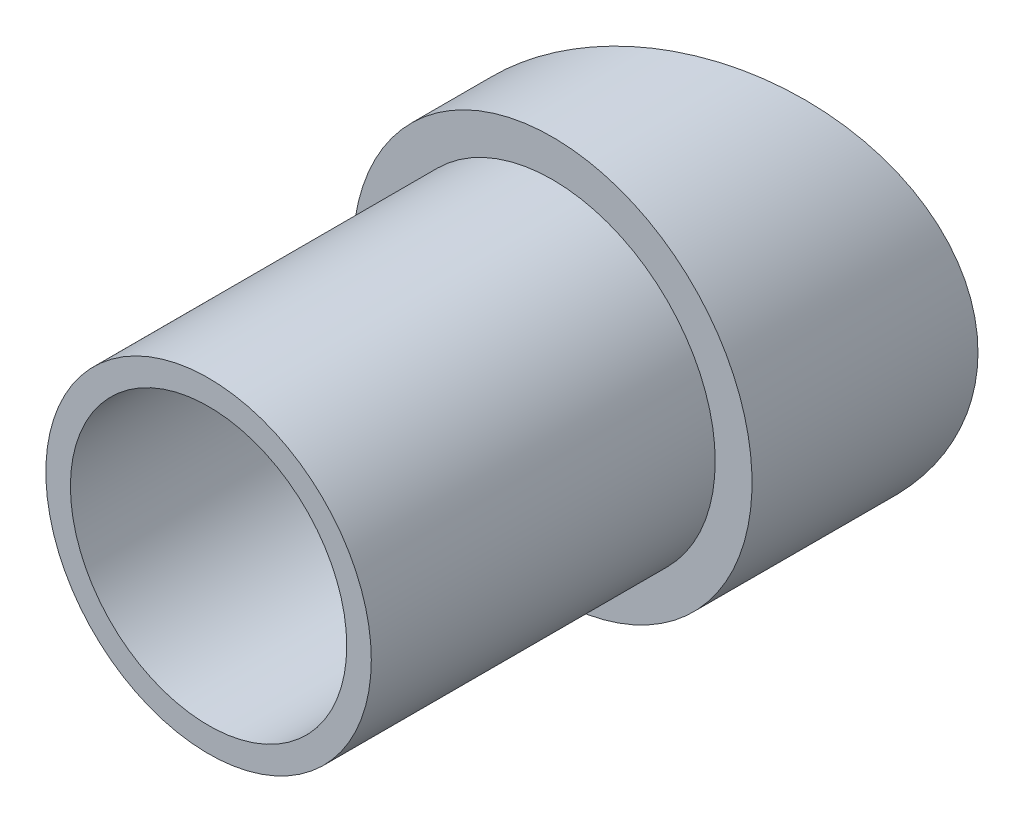
ISO-10303-21;
HEADER;
FILE_DESCRIPTION(('STEP AP214'),'2;1');
FILE_NAME('part.step','',(''),(''),'','','');
FILE_SCHEMA(('AUTOMOTIVE_DESIGN { 1 0 10303 214 1 1 1 1 }'));
ENDSEC;
DATA;
#1=APPLICATION_CONTEXT('core data for automotive mechanical design processes');
#2=APPLICATION_PROTOCOL_DEFINITION('international standard','automotive_design',2000,#1);
#3=PRODUCT_CONTEXT('',#1,'mechanical');
#4=PRODUCT('Part','Part','',(#3));
#5=PRODUCT_RELATED_PRODUCT_CATEGORY('part','',(#4));
#6=PRODUCT_DEFINITION_FORMATION('','',#4);
#7=PRODUCT_DEFINITION_CONTEXT('part definition',#1,'design');
#8=PRODUCT_DEFINITION('design','',#6,#7);
#9=PRODUCT_DEFINITION_SHAPE('','',#8);
#10=(LENGTH_UNIT() NAMED_UNIT(*) SI_UNIT(.MILLI.,.METRE.));
#11=(NAMED_UNIT(*) PLANE_ANGLE_UNIT() SI_UNIT($,.RADIAN.));
#12=(NAMED_UNIT(*) SI_UNIT($,.STERADIAN.) SOLID_ANGLE_UNIT());
#13=UNCERTAINTY_MEASURE_WITH_UNIT(LENGTH_MEASURE(1.E-05),#10,'distance_accuracy_value','');
#14=(GEOMETRIC_REPRESENTATION_CONTEXT(3) GLOBAL_UNCERTAINTY_ASSIGNED_CONTEXT((#13)) GLOBAL_UNIT_ASSIGNED_CONTEXT((#10,
#11,#12)) REPRESENTATION_CONTEXT('',''));
#15=CARTESIAN_POINT('',(0.,0.,0.));
#16=DIRECTION('',(0.,0.,1.));
#17=DIRECTION('',(1.,0.,0.));
#18=AXIS2_PLACEMENT_3D('',#15,#16,#17);
#19=CARTESIAN_POINT('',(4.27448013928005,0.,-29.4299558512105));
#20=DIRECTION('',(-0.390731128489275,0.,-0.92050485345244));
#21=DIRECTION('',(-0.92050485345244,0.,0.390731128489275));
#22=AXIS2_PLACEMENT_3D('',#19,#20,#21);
#23=CYLINDRICAL_SURFACE('',#22,2.1);
#24=CARTESIAN_POINT('',(0.,0.,-39.5));
#25=DIRECTION('',(-0.390731128489275,0.,-0.92050485345244));
#26=DIRECTION('',(-0.92050485345244,0.,0.390731128489275));
#27=AXIS2_PLACEMENT_3D('',#24,#25,#26);
#28=CIRCLE('',#27,2.1);
#29=CARTESIAN_POINT('',(-1.93306019225013,0.,-38.6794646301725));
#30=VERTEX_POINT('',#29);
#31=EDGE_CURVE('E144',#30,#30,#28,.T.);
#32=ORIENTED_EDGE('',*,*,#31,.T.);
#33=EDGE_LOOP('',(#32));
#34=FACE_BOUND('',#33,.T.);
#35=CARTESIAN_POINT('',(1.17219338546782,0.,-36.7384854396427));
#36=DIRECTION('',(0.390731128489274,0.,0.92050485345244));
#37=DIRECTION('',(0.92050485345244,0.,-0.390731128489274));
#38=AXIS2_PLACEMENT_3D('',#35,#36,#37);
#39=CIRCLE('',#38,2.1);
#40=CARTESIAN_POINT('',(3.10525357771794,0.,-37.5590208094702));
#41=VERTEX_POINT('',#40);
#42=EDGE_CURVE('E39',#41,#41,#39,.F.);
#43=ORIENTED_EDGE('',*,*,#42,.F.);
#44=EDGE_LOOP('',(#43));
#45=FACE_BOUND('',#44,.T.);
#46=ADVANCED_FACE('F35',(#34,#45),#23,.F.);
#47=CARTESIAN_POINT('',(0.,0.,-56.));
#48=DIRECTION('',(0.,0.,1.));
#49=DIRECTION('',(1.,0.,0.));
#50=AXIS2_PLACEMENT_3D('',#47,#48,#49);
#51=CYLINDRICAL_SURFACE('',#50,16.25);
#52=CARTESIAN_POINT('',(0.,0.,-28.));
#53=DIRECTION('',(0.,0.,-1.));
#54=DIRECTION('',(-1.,0.,0.));
#55=AXIS2_PLACEMENT_3D('',#52,#53,#54);
#56=CIRCLE('',#55,16.25);
#57=CARTESIAN_POINT('',(-16.25,0.,-28.));
#58=VERTEX_POINT('',#57);
#59=EDGE_CURVE('E153',#58,#58,#56,.T.);
#60=ORIENTED_EDGE('',*,*,#59,.T.);
#61=EDGE_LOOP('',(#60));
#62=FACE_BOUND('',#61,.T.);
#63=CARTESIAN_POINT('',(0.,0.,-39.5));
#64=DIRECTION('',(0.390731128489275,0.,0.92050485345244));
#65=DIRECTION('',(-0.92050485345244,0.,0.390731128489275));
#66=AXIS2_PLACEMENT_3D('',#63,#64,#65);
#67=ELLIPSE('',#66,17.6533561328361,16.25);
#68=CARTESIAN_POINT('',(-16.25,0.,-32.6022842365939));
#69=VERTEX_POINT('',#68);
#70=EDGE_CURVE('E12',#69,#69,#67,.T.);
#71=ORIENTED_EDGE('',*,*,#70,.T.);
#72=EDGE_LOOP('',(#71));
#73=FACE_BOUND('',#72,.T.);
#74=ADVANCED_FACE('F165',(#62,#73),#51,.T.);
#75=CARTESIAN_POINT('',(0.,0.,-28.));
#76=DIRECTION('',(0.,0.,1.));
#77=DIRECTION('',(1.,0.,0.));
#78=AXIS2_PLACEMENT_3D('',#75,#76,#77);
#79=CYLINDRICAL_SURFACE('',#78,13.25);
#80=CARTESIAN_POINT('',(0.,0.,-28.));
#81=DIRECTION('',(0.,0.,-1.));
#82=DIRECTION('',(-1.,0.,0.));
#83=AXIS2_PLACEMENT_3D('',#80,#81,#82);
#84=CIRCLE('',#83,13.25);
#85=CARTESIAN_POINT('',(-13.25,0.,-28.));
#86=VERTEX_POINT('',#85);
#87=EDGE_CURVE('E156',#86,#86,#84,.F.);
#88=ORIENTED_EDGE('',*,*,#87,.T.);
#89=EDGE_LOOP('',(#88));
#90=FACE_BOUND('',#89,.T.);
#91=CARTESIAN_POINT('',(0.,0.,0.));
#92=DIRECTION('',(0.,0.,1.));
#93=DIRECTION('',(1.,0.,0.));
#94=AXIS2_PLACEMENT_3D('',#91,#92,#93);
#95=CIRCLE('',#94,13.25);
#96=CARTESIAN_POINT('',(13.25,0.,0.));
#97=VERTEX_POINT('',#96);
#98=EDGE_CURVE('E44',#97,#97,#95,.T.);
#99=ORIENTED_EDGE('',*,*,#98,.F.);
#100=EDGE_LOOP('',(#99));
#101=FACE_BOUND('',#100,.T.);
#102=ADVANCED_FACE('F37',(#90,#101),#79,.T.);
#103=CARTESIAN_POINT('',(0.,0.,0.));
#104=DIRECTION('',(0.,0.,1.));
#105=DIRECTION('',(1.,0.,0.));
#106=AXIS2_PLACEMENT_3D('',#103,#104,#105);
#107=PLANE('',#106);
#108=CARTESIAN_POINT('',(0.,0.,0.));
#109=DIRECTION('',(0.,0.,1.));
#110=DIRECTION('',(1.,0.,0.));
#111=AXIS2_PLACEMENT_3D('',#108,#109,#110);
#112=CIRCLE('',#111,11.25);
#113=CARTESIAN_POINT('',(11.25,0.,0.));
#114=VERTEX_POINT('',#113);
#115=EDGE_CURVE('E147',#114,#114,#112,.T.);
#116=ORIENTED_EDGE('',*,*,#115,.F.);
#117=EDGE_LOOP('',(#116));
#118=FACE_BOUND('',#117,.T.);
#119=ORIENTED_EDGE('',*,*,#98,.T.);
#120=EDGE_LOOP('',(#119));
#121=FACE_BOUND('',#120,.T.);
#122=ADVANCED_FACE('F162',(#118,#121),#107,.T.);
#123=CARTESIAN_POINT('',(0.,0.,-28.));
#124=DIRECTION('',(0.,0.,-1.));
#125=DIRECTION('',(-1.,0.,0.));
#126=AXIS2_PLACEMENT_3D('',#123,#124,#125);
#127=PLANE('',#126);
#128=ORIENTED_EDGE('',*,*,#87,.F.);
#129=EDGE_LOOP('',(#128));
#130=FACE_BOUND('',#129,.T.);
#131=ORIENTED_EDGE('',*,*,#59,.F.);
#132=EDGE_LOOP('',(#131));
#133=FACE_BOUND('',#132,.T.);
#134=ADVANCED_FACE('F171',(#130,#133),#127,.F.);
#135=CARTESIAN_POINT('',(-16.25,-16.25,-32.6022842365939));
#136=DIRECTION('',(0.390731128489275,0.,0.92050485345244));
#137=DIRECTION('',(0.92050485345244,0.,-0.390731128489275));
#138=AXIS2_PLACEMENT_3D('',#135,#136,#137);
#139=PLANE('',#138);
#140=ORIENTED_EDGE('',*,*,#31,.F.);
#141=EDGE_LOOP('',(#140));
#142=FACE_BOUND('',#141,.T.);
#143=ORIENTED_EDGE('',*,*,#70,.F.);
#144=EDGE_LOOP('',(#143));
#145=FACE_BOUND('',#144,.T.);
#146=ADVANCED_FACE('F192',(#142,#145),#139,.F.);
#147=CARTESIAN_POINT('',(0.,0.,-72.2619884573732));
#148=DIRECTION('',(0.,0.,1.));
#149=DIRECTION('',(1.,0.,0.));
#150=AXIS2_PLACEMENT_3D('',#147,#148,#149);
#151=CYLINDRICAL_SURFACE('',#150,11.25);
#152=CARTESIAN_POINT('',(0.,0.,-34.0681981129735));
#153=DIRECTION('',(0.390731128489275,0.,0.92050485345244));
#154=DIRECTION('',(-0.92050485345244,0.,0.390731128489275));
#155=AXIS2_PLACEMENT_3D('',#152,#153,#154);
#156=ELLIPSE('',#155,12.2215542458096,11.25);
#157=CARTESIAN_POINT('',(-11.25,0.,-29.2928564306155));
#158=VERTEX_POINT('',#157);
#159=EDGE_CURVE('E150',#158,#158,#156,.F.);
#160=ORIENTED_EDGE('',*,*,#159,.T.);
#161=EDGE_LOOP('',(#160));
#162=FACE_BOUND('',#161,.T.);
#163=ORIENTED_EDGE('',*,*,#115,.T.);
#164=EDGE_LOOP('',(#163));
#165=FACE_BOUND('',#164,.T.);
#166=ADVANCED_FACE('F188',(#162,#165),#151,.F.);
#167=CARTESIAN_POINT('',(-14.2963443575536,-16.25,-27.9997599693317));
#168=DIRECTION('',(0.390731128489275,0.,0.92050485345244));
#169=DIRECTION('',(0.92050485345244,0.,-0.390731128489275));
#170=AXIS2_PLACEMENT_3D('',#167,#168,#169);
#171=PLANE('',#170);
#172=DIRECTION('',(0.460252426726219,0.866025403784439,-0.195365564244636));
#173=VECTOR('',#172,1.);
#174=CARTESIAN_POINT('',(3.84069059202387,-3.5507041555162,-35.6984745461408));
#175=LINE('',#174,#173);
#176=CARTESIAN_POINT('',(3.84069059202387,-3.5507041555162,-35.6984745461408));
#177=VERTEX_POINT('',#176);
#178=CARTESIAN_POINT('',(5.72772554160137,0.,-36.4994733595438));
#179=VERTEX_POINT('',#178);
#180=EDGE_CURVE('E51',#177,#179,#175,.T.);
#181=ORIENTED_EDGE('',*,*,#180,.F.);
#182=DIRECTION('',(0.920504853452439,0.,-0.390731128489276));
#183=VECTOR('',#182,1.);
#184=CARTESIAN_POINT('',(0.0666206928688681,-3.5507041555162,-34.0964769193348));
#185=LINE('',#184,#183);
#186=CARTESIAN_POINT('',(0.0666206928688681,-3.5507041555162,-34.0964769193348));
#187=VERTEX_POINT('',#186);
#188=EDGE_CURVE('E135',#187,#177,#185,.T.);
#189=ORIENTED_EDGE('',*,*,#188,.F.);
#190=DIRECTION('',(0.46025242672622,-0.866025403784439,-0.195365564244636));
#191=VECTOR('',#190,1.);
#192=CARTESIAN_POINT('',(-1.82041425670863,0.,-33.2954781059318));
#193=LINE('',#192,#191);
#194=CARTESIAN_POINT('',(-1.82041425670863,0.,-33.2954781059318));
#195=VERTEX_POINT('',#194);
#196=EDGE_CURVE('E133',#195,#187,#193,.T.);
#197=ORIENTED_EDGE('',*,*,#196,.F.);
#198=DIRECTION('',(-0.460252426726221,-0.866025403784439,0.195365564244636));
#199=VECTOR('',#198,1.);
#200=CARTESIAN_POINT('',(0.0666206928688698,3.5507041555162,-34.0964769193348));
#201=LINE('',#200,#199);
#202=CARTESIAN_POINT('',(0.0666206928688698,3.5507041555162,-34.0964769193348));
#203=VERTEX_POINT('',#202);
#204=EDGE_CURVE('E99',#203,#195,#201,.T.);
#205=ORIENTED_EDGE('',*,*,#204,.F.);
#206=DIRECTION('',(-0.92050485345244,0.,0.390731128489276));
#207=VECTOR('',#206,1.);
#208=CARTESIAN_POINT('',(3.84069059202388,3.5507041555162,-35.6984745461408));
#209=LINE('',#208,#207);
#210=CARTESIAN_POINT('',(3.84069059202388,3.5507041555162,-35.6984745461408));
#211=VERTEX_POINT('',#210);
#212=EDGE_CURVE('E129',#211,#203,#209,.T.);
#213=ORIENTED_EDGE('',*,*,#212,.F.);
#214=DIRECTION('',(-0.460252426726219,0.866025403784439,0.195365564244637));
#215=VECTOR('',#214,1.);
#216=CARTESIAN_POINT('',(5.72772554160137,0.,-36.4994733595438));
#217=LINE('',#216,#215);
#218=EDGE_CURVE('E126',#179,#211,#217,.T.);
#219=ORIENTED_EDGE('',*,*,#218,.F.);
#220=EDGE_LOOP('',(#181,#189,#197,#205,#213,#219));
#221=FACE_BOUND('',#220,.T.);
#222=ORIENTED_EDGE('',*,*,#159,.F.);
#223=EDGE_LOOP('',(#222));
#224=FACE_BOUND('',#223,.T.);
#225=ADVANCED_FACE('F185',(#221,#224),#171,.T.);
#226=CARTESIAN_POINT('',(-13.0347676712206,0.,-30.7079882562079));
#227=DIRECTION('',(0.390731128489274,0.,0.92050485345244));
#228=DIRECTION('',(0.92050485345244,0.,-0.390731128489274));
#229=AXIS2_PLACEMENT_3D('',#226,#227,#228);
#230=PLANE('',#229);
#231=DIRECTION('',(0.460252426726219,0.866025403784439,-0.195365564244636));
#232=VECTOR('',#231,1.);
#233=CARTESIAN_POINT('',(3.05922833504532,-3.5507041555162,-37.5394842530457));
#234=LINE('',#233,#232);
#235=CARTESIAN_POINT('',(3.05922833504532,-3.5507041555162,-37.5394842530457));
#236=VERTEX_POINT('',#235);
#237=CARTESIAN_POINT('',(4.94626328462282,0.,-38.3404830664487));
#238=VERTEX_POINT('',#237);
#239=EDGE_CURVE('E137',#236,#238,#234,.T.);
#240=ORIENTED_EDGE('',*,*,#239,.T.);
#241=DIRECTION('',(-0.460252426726219,0.866025403784439,0.195365564244637));
#242=VECTOR('',#241,1.);
#243=CARTESIAN_POINT('',(4.94626328462282,0.,-38.3404830664487));
#244=LINE('',#243,#242);
#245=CARTESIAN_POINT('',(3.05922833504533,3.5507041555162,-37.5394842530457));
#246=VERTEX_POINT('',#245);
#247=EDGE_CURVE('E120',#238,#246,#244,.T.);
#248=ORIENTED_EDGE('',*,*,#247,.T.);
#249=DIRECTION('',(-0.92050485345244,0.,0.390731128489276));
#250=VECTOR('',#249,1.);
#251=CARTESIAN_POINT('',(3.05922833504533,3.5507041555162,-37.5394842530457));
#252=LINE('',#251,#250);
#253=CARTESIAN_POINT('',(-0.71484156410968,3.5507041555162,-35.9374866262397));
#254=VERTEX_POINT('',#253);
#255=EDGE_CURVE('E118',#246,#254,#252,.T.);
#256=ORIENTED_EDGE('',*,*,#255,.T.);
#257=DIRECTION('',(-0.460252426726221,-0.866025403784439,0.195365564244636));
#258=VECTOR('',#257,1.);
#259=CARTESIAN_POINT('',(-0.71484156410968,3.5507041555162,-35.9374866262397));
#260=LINE('',#259,#258);
#261=CARTESIAN_POINT('',(-2.60187651368718,0.,-35.1364878128367));
#262=VERTEX_POINT('',#261);
#263=EDGE_CURVE('E96',#254,#262,#260,.T.);
#264=ORIENTED_EDGE('',*,*,#263,.T.);
#265=DIRECTION('',(0.46025242672622,-0.866025403784439,-0.195365564244636));
#266=VECTOR('',#265,1.);
#267=CARTESIAN_POINT('',(-2.60187651368718,0.,-35.1364878128367));
#268=LINE('',#267,#266);
#269=CARTESIAN_POINT('',(-0.714841564109682,-3.5507041555162,-35.9374866262397));
#270=VERTEX_POINT('',#269);
#271=EDGE_CURVE('E107',#262,#270,#268,.T.);
#272=ORIENTED_EDGE('',*,*,#271,.T.);
#273=DIRECTION('',(0.920504853452439,0.,-0.390731128489276));
#274=VECTOR('',#273,1.);
#275=CARTESIAN_POINT('',(-0.714841564109682,-3.5507041555162,-35.9374866262397));
#276=LINE('',#275,#274);
#277=EDGE_CURVE('E111',#270,#236,#276,.T.);
#278=ORIENTED_EDGE('',*,*,#277,.T.);
#279=EDGE_LOOP('',(#240,#248,#256,#264,#272,#278));
#280=FACE_BOUND('',#279,.T.);
#281=ORIENTED_EDGE('',*,*,#42,.T.);
#282=EDGE_LOOP('',(#281));
#283=FACE_BOUND('',#282,.T.);
#284=ADVANCED_FACE('F114',(#280,#283),#230,.T.);
#285=CARTESIAN_POINT('',(3.05922833504532,-3.5507041555162,-37.5394842530457));
#286=DIRECTION('',(0.797180587396685,-0.499999999999999,-0.338383083321074));
#287=DIRECTION('',(0.531344860895239,0.847155616637356,0.));
#288=AXIS2_PLACEMENT_3D('',#285,#286,#287);
#289=PLANE('',#288);
#290=ORIENTED_EDGE('',*,*,#180,.T.);
#291=DIRECTION('',(0.390731128489275,0.,0.92050485345244));
#292=VECTOR('',#291,1.);
#293=CARTESIAN_POINT('',(4.94626328462282,0.,-38.3404830664487));
#294=LINE('',#293,#292);
#295=EDGE_CURVE('E81',#238,#179,#294,.T.);
#296=ORIENTED_EDGE('',*,*,#295,.F.);
#297=ORIENTED_EDGE('',*,*,#239,.F.);
#298=DIRECTION('',(0.390731128489275,0.,0.92050485345244));
#299=VECTOR('',#298,1.);
#300=CARTESIAN_POINT('',(3.05922833504532,-3.5507041555162,-37.5394842530457));
#301=LINE('',#300,#299);
#302=EDGE_CURVE('E59',#236,#177,#301,.T.);
#303=ORIENTED_EDGE('',*,*,#302,.T.);
#304=EDGE_LOOP('',(#290,#296,#297,#303));
#305=FACE_BOUND('',#304,.T.);
#306=ADVANCED_FACE('F183',(#305),#289,.F.);
#307=CARTESIAN_POINT('',(-0.714841564109682,-3.5507041555162,-35.9374866262397));
#308=DIRECTION('',(0.,-1.,0.));
#309=DIRECTION('',(1.,0.,0.));
#310=AXIS2_PLACEMENT_3D('',#307,#308,#309);
#311=PLANE('',#310);
#312=ORIENTED_EDGE('',*,*,#188,.T.);
#313=ORIENTED_EDGE('',*,*,#302,.F.);
#314=ORIENTED_EDGE('',*,*,#277,.F.);
#315=DIRECTION('',(0.390731128489275,0.,0.92050485345244));
#316=VECTOR('',#315,1.);
#317=CARTESIAN_POINT('',(-0.714841564109682,-3.5507041555162,-35.9374866262397));
#318=LINE('',#317,#316);
#319=EDGE_CURVE('E103',#270,#187,#318,.T.);
#320=ORIENTED_EDGE('',*,*,#319,.T.);
#321=EDGE_LOOP('',(#312,#313,#314,#320));
#322=FACE_BOUND('',#321,.T.);
#323=ADVANCED_FACE('F234',(#322),#311,.F.);
#324=CARTESIAN_POINT('',(-2.60187651368718,0.,-35.1364878128367));
#325=DIRECTION('',(-0.797180587396685,-0.5,0.338383083321074));
#326=DIRECTION('',(0.53134486089524,-0.847155616637355,0.));
#327=AXIS2_PLACEMENT_3D('',#324,#325,#326);
#328=PLANE('',#327);
#329=ORIENTED_EDGE('',*,*,#196,.T.);
#330=ORIENTED_EDGE('',*,*,#319,.F.);
#331=ORIENTED_EDGE('',*,*,#271,.F.);
#332=DIRECTION('',(0.390731128489275,0.,0.92050485345244));
#333=VECTOR('',#332,1.);
#334=CARTESIAN_POINT('',(-2.60187651368718,0.,-35.1364878128367));
#335=LINE('',#334,#333);
#336=EDGE_CURVE('E92',#262,#195,#335,.T.);
#337=ORIENTED_EDGE('',*,*,#336,.T.);
#338=EDGE_LOOP('',(#329,#330,#331,#337));
#339=FACE_BOUND('',#338,.T.);
#340=ADVANCED_FACE('F108',(#339),#328,.F.);
#341=CARTESIAN_POINT('',(-0.71484156410968,3.5507041555162,-35.9374866262397));
#342=DIRECTION('',(-0.797180587396685,0.5,0.338383083321074));
#343=DIRECTION('',(-0.531344860895241,-0.847155616637355,0.));
#344=AXIS2_PLACEMENT_3D('',#341,#342,#343);
#345=PLANE('',#344);
#346=ORIENTED_EDGE('',*,*,#204,.T.);
#347=ORIENTED_EDGE('',*,*,#336,.F.);
#348=ORIENTED_EDGE('',*,*,#263,.F.);
#349=DIRECTION('',(0.390731128489275,0.,0.92050485345244));
#350=VECTOR('',#349,1.);
#351=CARTESIAN_POINT('',(-0.71484156410968,3.5507041555162,-35.9374866262397));
#352=LINE('',#351,#350);
#353=EDGE_CURVE('E104',#254,#203,#352,.T.);
#354=ORIENTED_EDGE('',*,*,#353,.T.);
#355=EDGE_LOOP('',(#346,#347,#348,#354));
#356=FACE_BOUND('',#355,.T.);
#357=ADVANCED_FACE('F94',(#356),#345,.F.);
#358=CARTESIAN_POINT('',(3.05922833504533,3.5507041555162,-37.5394842530457));
#359=DIRECTION('',(0.,1.,0.));
#360=DIRECTION('',(0.,0.,1.));
#361=AXIS2_PLACEMENT_3D('',#358,#359,#360);
#362=PLANE('',#361);
#363=ORIENTED_EDGE('',*,*,#212,.T.);
#364=ORIENTED_EDGE('',*,*,#353,.F.);
#365=ORIENTED_EDGE('',*,*,#255,.F.);
#366=DIRECTION('',(0.390731128489275,0.,0.92050485345244));
#367=VECTOR('',#366,1.);
#368=CARTESIAN_POINT('',(3.05922833504533,3.5507041555162,-37.5394842530457));
#369=LINE('',#368,#367);
#370=EDGE_CURVE('E141',#246,#211,#369,.T.);
#371=ORIENTED_EDGE('',*,*,#370,.T.);
#372=EDGE_LOOP('',(#363,#364,#365,#371));
#373=FACE_BOUND('',#372,.T.);
#374=ADVANCED_FACE('F252',(#373),#362,.F.);
#375=CARTESIAN_POINT('',(4.94626328462282,0.,-38.3404830664487));
#376=DIRECTION('',(0.797180587396685,0.499999999999999,-0.338383083321074));
#377=DIRECTION('',(-0.531344860895239,0.847155616637356,0.));
#378=AXIS2_PLACEMENT_3D('',#375,#376,#377);
#379=PLANE('',#378);
#380=ORIENTED_EDGE('',*,*,#218,.T.);
#381=ORIENTED_EDGE('',*,*,#370,.F.);
#382=ORIENTED_EDGE('',*,*,#247,.F.);
#383=ORIENTED_EDGE('',*,*,#295,.T.);
#384=EDGE_LOOP('',(#380,#381,#382,#383));
#385=FACE_BOUND('',#384,.T.);
#386=ADVANCED_FACE('F259',(#385),#379,.F.);
#387=CLOSED_SHELL('',(#46,#74,#102,#122,#134,#146,#166,#225,#284,#306,#323,#340,#357,#374,#386));
#388=MANIFOLD_SOLID_BREP('B2',#387);
#389=ADVANCED_BREP_SHAPE_REPRESENTATION('',(#18,#388),#14);
#390=SHAPE_DEFINITION_REPRESENTATION(#9,#389);
ENDSEC;
END-ISO-10303-21;
